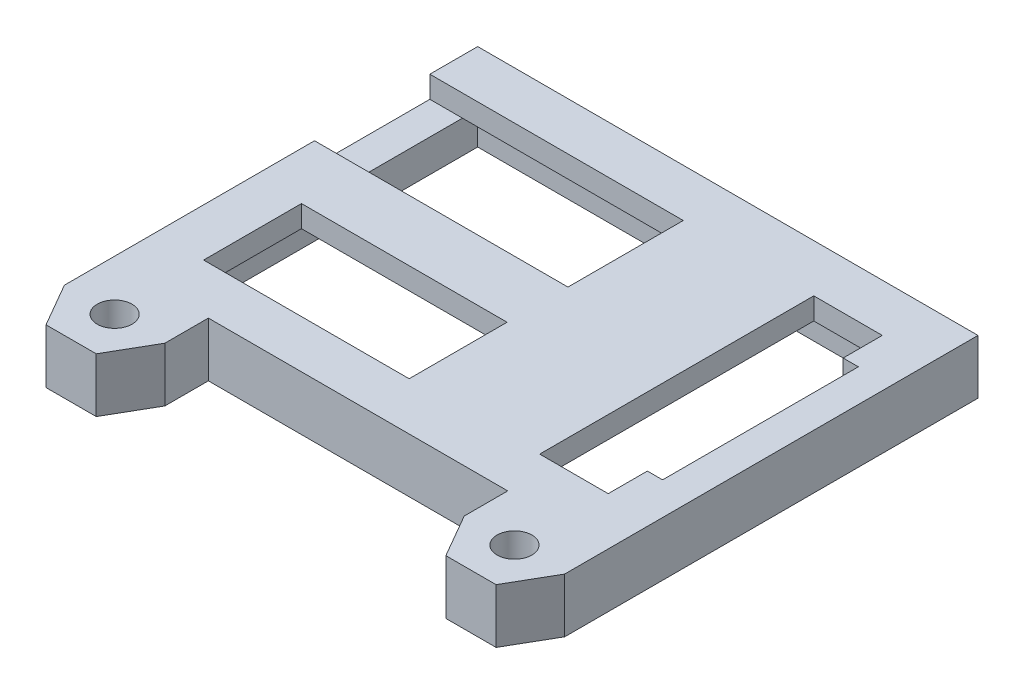
ISO-10303-21;
HEADER;
FILE_DESCRIPTION(('STEP AP214'),'2;1');
FILE_NAME('part.step','',(''),(''),'','','');
FILE_SCHEMA(('AUTOMOTIVE_DESIGN { 1 0 10303 214 1 1 1 1 }'));
ENDSEC;
DATA;
#1=APPLICATION_CONTEXT('core data for automotive mechanical design processes');
#2=APPLICATION_PROTOCOL_DEFINITION('international standard','automotive_design',2000,#1);
#3=PRODUCT_CONTEXT('',#1,'mechanical');
#4=PRODUCT('Part','Part','',(#3));
#5=PRODUCT_RELATED_PRODUCT_CATEGORY('part','',(#4));
#6=PRODUCT_DEFINITION_FORMATION('','',#4);
#7=PRODUCT_DEFINITION_CONTEXT('part definition',#1,'design');
#8=PRODUCT_DEFINITION('design','',#6,#7);
#9=PRODUCT_DEFINITION_SHAPE('','',#8);
#10=(LENGTH_UNIT() NAMED_UNIT(*) SI_UNIT(.MILLI.,.METRE.));
#11=(NAMED_UNIT(*) PLANE_ANGLE_UNIT() SI_UNIT($,.RADIAN.));
#12=(NAMED_UNIT(*) SI_UNIT($,.STERADIAN.) SOLID_ANGLE_UNIT());
#13=UNCERTAINTY_MEASURE_WITH_UNIT(LENGTH_MEASURE(1.E-05),#10,'distance_accuracy_value','');
#14=(GEOMETRIC_REPRESENTATION_CONTEXT(3) GLOBAL_UNCERTAINTY_ASSIGNED_CONTEXT((#13)) GLOBAL_UNIT_ASSIGNED_CONTEXT((#10,
#11,#12)) REPRESENTATION_CONTEXT('',''));
#15=CARTESIAN_POINT('',(0.,0.,0.));
#16=DIRECTION('',(0.,0.,1.));
#17=DIRECTION('',(1.,0.,0.));
#18=AXIS2_PLACEMENT_3D('',#15,#16,#17);
#19=CARTESIAN_POINT('',(0.,-2.,17.));
#20=DIRECTION('',(0.,0.,1.));
#21=DIRECTION('',(1.,0.,0.));
#22=AXIS2_PLACEMENT_3D('',#19,#20,#21);
#23=PLANE('',#22);
#24=DIRECTION('',(-1.,0.,0.));
#25=VECTOR('',#24,1.);
#26=CARTESIAN_POINT('',(-23.,-5.,17.));
#27=LINE('',#26,#25);
#28=CARTESIAN_POINT('',(13.762395692966,-5.,17.));
#29=VERTEX_POINT('',#28);
#30=CARTESIAN_POINT('',(-13.762395692966,-5.,17.));
#31=VERTEX_POINT('',#30);
#32=EDGE_CURVE('E64',#29,#31,#27,.T.);
#33=ORIENTED_EDGE('',*,*,#32,.F.);
#34=DIRECTION('',(0.,1.,0.));
#35=VECTOR('',#34,1.);
#36=CARTESIAN_POINT('',(13.762395692966,-5.,17.));
#37=LINE('',#36,#35);
#38=CARTESIAN_POINT('',(13.762395692966,0.,17.));
#39=VERTEX_POINT('',#38);
#40=EDGE_CURVE('E57',#29,#39,#37,.T.);
#41=ORIENTED_EDGE('',*,*,#40,.T.);
#42=DIRECTION('',(1.,0.,0.));
#43=VECTOR('',#42,1.);
#44=CARTESIAN_POINT('',(0.,0.,17.));
#45=LINE('',#44,#43);
#46=CARTESIAN_POINT('',(-13.762395692966,0.,17.));
#47=VERTEX_POINT('',#46);
#48=EDGE_CURVE('E447',#47,#39,#45,.T.);
#49=ORIENTED_EDGE('',*,*,#48,.F.);
#50=DIRECTION('',(0.,1.,0.));
#51=VECTOR('',#50,1.);
#52=CARTESIAN_POINT('',(-13.762395692966,-5.,17.));
#53=LINE('',#52,#51);
#54=EDGE_CURVE('E347',#31,#47,#53,.T.);
#55=ORIENTED_EDGE('',*,*,#54,.F.);
#56=EDGE_LOOP('',(#33,#41,#49,#55));
#57=FACE_BOUND('',#56,.T.);
#58=ADVANCED_FACE('F39',(#57),#23,.T.);
#59=CARTESIAN_POINT('',(0.,-2.,-12.6));
#60=DIRECTION('',(0.,0.,-1.));
#61=DIRECTION('',(-1.,0.,0.));
#62=AXIS2_PLACEMENT_3D('',#59,#60,#61);
#63=PLANE('',#62);
#64=DIRECTION('',(-1.,0.,0.));
#65=VECTOR('',#64,1.);
#66=CARTESIAN_POINT('',(0.,0.,-12.6));
#67=LINE('',#66,#65);
#68=CARTESIAN_POINT('',(18.6,0.,-12.6));
#69=VERTEX_POINT('',#68);
#70=CARTESIAN_POINT('',(12.3,0.,-12.6));
#71=VERTEX_POINT('',#70);
#72=EDGE_CURVE('E441',#69,#71,#67,.T.);
#73=ORIENTED_EDGE('',*,*,#72,.T.);
#74=DIRECTION('',(0.,1.,0.));
#75=VECTOR('',#74,1.);
#76=CARTESIAN_POINT('',(12.3,-2.,-12.6));
#77=LINE('',#76,#75);
#78=CARTESIAN_POINT('',(12.3,-2.,-12.6));
#79=VERTEX_POINT('',#78);
#80=EDGE_CURVE('E471',#79,#71,#77,.T.);
#81=ORIENTED_EDGE('',*,*,#80,.F.);
#82=DIRECTION('',(-1.,0.,0.));
#83=VECTOR('',#82,1.);
#84=CARTESIAN_POINT('',(0.,-2.,-12.6));
#85=LINE('',#84,#83);
#86=CARTESIAN_POINT('',(18.6,-2.,-12.6));
#87=VERTEX_POINT('',#86);
#88=EDGE_CURVE('E406',#87,#79,#85,.T.);
#89=ORIENTED_EDGE('',*,*,#88,.F.);
#90=DIRECTION('',(0.,1.,0.));
#91=VECTOR('',#90,1.);
#92=CARTESIAN_POINT('',(18.6,-2.,-12.6));
#93=LINE('',#92,#91);
#94=EDGE_CURVE('E486',#87,#69,#93,.T.);
#95=ORIENTED_EDGE('',*,*,#94,.T.);
#96=EDGE_LOOP('',(#73,#81,#89,#95));
#97=FACE_BOUND('',#96,.T.);
#98=ADVANCED_FACE('F596',(#97),#63,.F.);
#99=CARTESIAN_POINT('',(12.3,-2.,0.));
#100=DIRECTION('',(1.,0.,0.));
#101=DIRECTION('',(0.,0.,-1.));
#102=AXIS2_PLACEMENT_3D('',#99,#100,#101);
#103=PLANE('',#102);
#104=DIRECTION('',(0.,0.,-1.));
#105=VECTOR('',#104,1.);
#106=CARTESIAN_POINT('',(12.3,0.,0.));
#107=LINE('',#106,#105);
#108=CARTESIAN_POINT('',(12.3,0.,12.6));
#109=VERTEX_POINT('',#108);
#110=EDGE_CURVE('E393',#109,#71,#107,.T.);
#111=ORIENTED_EDGE('',*,*,#110,.F.);
#112=DIRECTION('',(0.,1.,0.));
#113=VECTOR('',#112,1.);
#114=CARTESIAN_POINT('',(12.3,-2.,12.6));
#115=LINE('',#114,#113);
#116=CARTESIAN_POINT('',(12.3,-2.,12.6));
#117=VERTEX_POINT('',#116);
#118=EDGE_CURVE('E473',#117,#109,#115,.T.);
#119=ORIENTED_EDGE('',*,*,#118,.F.);
#120=DIRECTION('',(0.,0.,-1.));
#121=VECTOR('',#120,1.);
#122=CARTESIAN_POINT('',(12.3,-2.,0.));
#123=LINE('',#122,#121);
#124=EDGE_CURVE('E423',#117,#79,#123,.T.);
#125=ORIENTED_EDGE('',*,*,#124,.T.);
#126=ORIENTED_EDGE('',*,*,#80,.T.);
#127=EDGE_LOOP('',(#111,#119,#125,#126));
#128=FACE_BOUND('',#127,.T.);
#129=ADVANCED_FACE('F599',(#128),#103,.T.);
#130=CARTESIAN_POINT('',(0.,-2.,12.6));
#131=DIRECTION('',(0.,0.,1.));
#132=DIRECTION('',(1.,0.,0.));
#133=AXIS2_PLACEMENT_3D('',#130,#131,#132);
#134=PLANE('',#133);
#135=DIRECTION('',(1.,0.,0.));
#136=VECTOR('',#135,1.);
#137=CARTESIAN_POINT('',(0.,0.,12.6));
#138=LINE('',#137,#136);
#139=CARTESIAN_POINT('',(18.6,0.,12.6));
#140=VERTEX_POINT('',#139);
#141=EDGE_CURVE('E436',#109,#140,#138,.T.);
#142=ORIENTED_EDGE('',*,*,#141,.T.);
#143=DIRECTION('',(0.,1.,0.));
#144=VECTOR('',#143,1.);
#145=CARTESIAN_POINT('',(18.6,-2.,12.6));
#146=LINE('',#145,#144);
#147=CARTESIAN_POINT('',(18.6,-2.,12.6));
#148=VERTEX_POINT('',#147);
#149=EDGE_CURVE('E475',#148,#140,#146,.T.);
#150=ORIENTED_EDGE('',*,*,#149,.F.);
#151=DIRECTION('',(1.,0.,0.));
#152=VECTOR('',#151,1.);
#153=CARTESIAN_POINT('',(0.,-2.,12.6));
#154=LINE('',#153,#152);
#155=EDGE_CURVE('E400',#117,#148,#154,.T.);
#156=ORIENTED_EDGE('',*,*,#155,.F.);
#157=ORIENTED_EDGE('',*,*,#118,.T.);
#158=EDGE_LOOP('',(#142,#150,#156,#157));
#159=FACE_BOUND('',#158,.T.);
#160=ADVANCED_FACE('F605',(#159),#134,.F.);
#161=CARTESIAN_POINT('',(18.5999999999961,-2.,-5.77200324573237E-12));
#162=DIRECTION('',(-1.,0.,3.10322755146967E-13));
#163=DIRECTION('',(3.10322755146967E-13,0.,1.));
#164=AXIS2_PLACEMENT_3D('',#161,#162,#163);
#165=PLANE('',#164);
#166=DIRECTION('',(3.10322755146967E-13,0.,1.));
#167=VECTOR('',#166,1.);
#168=CARTESIAN_POINT('',(18.5999999999961,0.,-5.77200324573237E-12));
#169=LINE('',#168,#167);
#170=CARTESIAN_POINT('',(18.5999999999994,0.,9.00000000000005));
#171=VERTEX_POINT('',#170);
#172=EDGE_CURVE('E466',#171,#140,#169,.T.);
#173=ORIENTED_EDGE('',*,*,#172,.F.);
#174=DIRECTION('',(0.,1.,0.));
#175=VECTOR('',#174,1.);
#176=CARTESIAN_POINT('',(18.5999999999994,-2.,9.00000000000005));
#177=LINE('',#176,#175);
#178=CARTESIAN_POINT('',(18.5999999999994,-2.,9.00000000000005));
#179=VERTEX_POINT('',#178);
#180=EDGE_CURVE('E477',#179,#171,#177,.T.);
#181=ORIENTED_EDGE('',*,*,#180,.F.);
#182=DIRECTION('',(3.10322755146967E-13,0.,1.));
#183=VECTOR('',#182,1.);
#184=CARTESIAN_POINT('',(18.5999999999961,-2.,-5.77200324573237E-12));
#185=LINE('',#184,#183);
#186=EDGE_CURVE('E420',#179,#148,#185,.T.);
#187=ORIENTED_EDGE('',*,*,#186,.T.);
#188=ORIENTED_EDGE('',*,*,#149,.T.);
#189=EDGE_LOOP('',(#173,#181,#187,#188));
#190=FACE_BOUND('',#189,.T.);
#191=ADVANCED_FACE('F607',(#190),#165,.T.);
#192=CARTESIAN_POINT('',(0.,-2.,8.99999999999987));
#193=DIRECTION('',(0.,0.,1.));
#194=DIRECTION('',(1.,0.,0.));
#195=AXIS2_PLACEMENT_3D('',#192,#193,#194);
#196=PLANE('',#195);
#197=DIRECTION('',(1.,0.,0.));
#198=VECTOR('',#197,1.);
#199=CARTESIAN_POINT('',(0.,0.,8.99999999999987));
#200=LINE('',#199,#198);
#201=CARTESIAN_POINT('',(20.,0.,9.00000000000006));
#202=VERTEX_POINT('',#201);
#203=EDGE_CURVE('E464',#171,#202,#200,.T.);
#204=ORIENTED_EDGE('',*,*,#203,.T.);
#205=DIRECTION('',(0.,1.,0.));
#206=VECTOR('',#205,1.);
#207=CARTESIAN_POINT('',(20.,-2.,9.00000000000006));
#208=LINE('',#207,#206);
#209=CARTESIAN_POINT('',(20.,-2.,9.00000000000006));
#210=VERTEX_POINT('',#209);
#211=EDGE_CURVE('E479',#210,#202,#208,.T.);
#212=ORIENTED_EDGE('',*,*,#211,.F.);
#213=DIRECTION('',(1.,0.,0.));
#214=VECTOR('',#213,1.);
#215=CARTESIAN_POINT('',(0.,-2.,8.99999999999987));
#216=LINE('',#215,#214);
#217=EDGE_CURVE('E417',#179,#210,#216,.T.);
#218=ORIENTED_EDGE('',*,*,#217,.F.);
#219=ORIENTED_EDGE('',*,*,#180,.T.);
#220=EDGE_LOOP('',(#204,#212,#218,#219));
#221=FACE_BOUND('',#220,.T.);
#222=ADVANCED_FACE('F536',(#221),#196,.F.);
#223=CARTESIAN_POINT('',(20.,-2.,0.));
#224=DIRECTION('',(1.,0.,0.));
#225=DIRECTION('',(0.,0.,-1.));
#226=AXIS2_PLACEMENT_3D('',#223,#224,#225);
#227=PLANE('',#226);
#228=DIRECTION('',(0.,0.,-1.));
#229=VECTOR('',#228,1.);
#230=CARTESIAN_POINT('',(20.,0.,0.));
#231=LINE('',#230,#229);
#232=CARTESIAN_POINT('',(20.,0.,-8.99999999999994));
#233=VERTEX_POINT('',#232);
#234=EDGE_CURVE('E461',#202,#233,#231,.T.);
#235=ORIENTED_EDGE('',*,*,#234,.T.);
#236=DIRECTION('',(0.,1.,0.));
#237=VECTOR('',#236,1.);
#238=CARTESIAN_POINT('',(20.,-2.,-8.99999999999994));
#239=LINE('',#238,#237);
#240=CARTESIAN_POINT('',(20.,-2.,-8.99999999999994));
#241=VERTEX_POINT('',#240);
#242=EDGE_CURVE('E482',#241,#233,#239,.T.);
#243=ORIENTED_EDGE('',*,*,#242,.F.);
#244=DIRECTION('',(0.,0.,1.));
#245=VECTOR('',#244,1.);
#246=CARTESIAN_POINT('',(20.,-2.,-14.));
#247=LINE('',#246,#245);
#248=CARTESIAN_POINT('',(20.,-2.,-14.));
#249=VERTEX_POINT('',#248);
#250=EDGE_CURVE('E50',#249,#241,#247,.T.);
#251=ORIENTED_EDGE('',*,*,#250,.F.);
#252=DIRECTION('',(0.,1.,0.));
#253=VECTOR('',#252,1.);
#254=CARTESIAN_POINT('',(20.,-5.,-14.));
#255=LINE('',#254,#253);
#256=CARTESIAN_POINT('',(20.,-5.,-14.));
#257=VERTEX_POINT('',#256);
#258=EDGE_CURVE('E373',#257,#249,#255,.T.);
#259=ORIENTED_EDGE('',*,*,#258,.F.);
#260=DIRECTION('',(0.,0.,1.));
#261=VECTOR('',#260,1.);
#262=CARTESIAN_POINT('',(20.,-5.,-14.));
#263=LINE('',#262,#261);
#264=CARTESIAN_POINT('',(20.,-5.,14.));
#265=VERTEX_POINT('',#264);
#266=EDGE_CURVE('E356',#257,#265,#263,.T.);
#267=ORIENTED_EDGE('',*,*,#266,.T.);
#268=DIRECTION('',(0.,1.,0.));
#269=VECTOR('',#268,1.);
#270=CARTESIAN_POINT('',(20.,-5.,14.));
#271=LINE('',#270,#269);
#272=CARTESIAN_POINT('',(20.,-2.,14.));
#273=VERTEX_POINT('',#272);
#274=EDGE_CURVE('E371',#265,#273,#271,.T.);
#275=ORIENTED_EDGE('',*,*,#274,.T.);
#276=EDGE_CURVE('E11',#210,#273,#247,.T.);
#277=ORIENTED_EDGE('',*,*,#276,.F.);
#278=ORIENTED_EDGE('',*,*,#211,.T.);
#279=EDGE_LOOP('',(#235,#243,#251,#259,#267,#275,#277,#278));
#280=FACE_BOUND('',#279,.T.);
#281=ADVANCED_FACE('F540',(#280),#227,.F.);
#282=CARTESIAN_POINT('',(0.,-2.,-9.00000000000013));
#283=DIRECTION('',(0.,0.,1.));
#284=DIRECTION('',(1.,0.,0.));
#285=AXIS2_PLACEMENT_3D('',#282,#283,#284);
#286=PLANE('',#285);
#287=DIRECTION('',(1.,0.,0.));
#288=VECTOR('',#287,1.);
#289=CARTESIAN_POINT('',(0.,0.,-9.00000000000013));
#290=LINE('',#289,#288);
#291=CARTESIAN_POINT('',(18.6,0.,-8.99999999999994));
#292=VERTEX_POINT('',#291);
#293=EDGE_CURVE('E458',#292,#233,#290,.T.);
#294=ORIENTED_EDGE('',*,*,#293,.F.);
#295=DIRECTION('',(0.,1.,0.));
#296=VECTOR('',#295,1.);
#297=CARTESIAN_POINT('',(18.6,-2.,-8.99999999999994));
#298=LINE('',#297,#296);
#299=CARTESIAN_POINT('',(18.6,-2.,-8.99999999999994));
#300=VERTEX_POINT('',#299);
#301=EDGE_CURVE('E484',#300,#292,#298,.T.);
#302=ORIENTED_EDGE('',*,*,#301,.F.);
#303=DIRECTION('',(1.,0.,0.));
#304=VECTOR('',#303,1.);
#305=CARTESIAN_POINT('',(0.,-2.,-9.00000000000013));
#306=LINE('',#305,#304);
#307=EDGE_CURVE('E414',#300,#241,#306,.T.);
#308=ORIENTED_EDGE('',*,*,#307,.T.);
#309=ORIENTED_EDGE('',*,*,#242,.T.);
#310=EDGE_LOOP('',(#294,#302,#308,#309));
#311=FACE_BOUND('',#310,.T.);
#312=ADVANCED_FACE('F549',(#311),#286,.T.);
#313=CARTESIAN_POINT('',(0.3,0.,-12.6));
#314=VERTEX_POINT('',#313);
#315=CARTESIAN_POINT('',(-23.,0.,-12.6));
#316=VERTEX_POINT('',#315);
#317=EDGE_CURVE('E438',#314,#316,#67,.T.);
#318=ORIENTED_EDGE('',*,*,#317,.T.);
#319=DIRECTION('',(0.,1.,0.));
#320=VECTOR('',#319,1.);
#321=CARTESIAN_POINT('',(-23.,-2.,-12.6));
#322=LINE('',#321,#320);
#323=CARTESIAN_POINT('',(-23.,-2.,-12.6));
#324=VERTEX_POINT('',#323);
#325=EDGE_CURVE('E488',#324,#316,#322,.T.);
#326=ORIENTED_EDGE('',*,*,#325,.F.);
#327=CARTESIAN_POINT('',(-20.,-2.,-12.6));
#328=VERTEX_POINT('',#327);
#329=EDGE_CURVE('E402',#328,#324,#85,.T.);
#330=ORIENTED_EDGE('',*,*,#329,.F.);
#331=CARTESIAN_POINT('',(0.3,-2.,-12.6));
#332=VERTEX_POINT('',#331);
#333=EDGE_CURVE('E403',#332,#328,#85,.T.);
#334=ORIENTED_EDGE('',*,*,#333,.F.);
#335=DIRECTION('',(0.,1.,0.));
#336=VECTOR('',#335,1.);
#337=CARTESIAN_POINT('',(0.3,-2.,-12.6));
#338=LINE('',#337,#336);
#339=EDGE_CURVE('E499',#332,#314,#338,.T.);
#340=ORIENTED_EDGE('',*,*,#339,.T.);
#341=EDGE_LOOP('',(#318,#326,#330,#334,#340));
#342=FACE_BOUND('',#341,.T.);
#343=ADVANCED_FACE('F585',(#342),#63,.F.);
#344=CARTESIAN_POINT('',(-23.,-2.,0.));
#345=DIRECTION('',(-1.,0.,0.));
#346=DIRECTION('',(0.,0.,1.));
#347=AXIS2_PLACEMENT_3D('',#344,#345,#346);
#348=PLANE('',#347);
#349=DIRECTION('',(0.,0.,1.));
#350=VECTOR('',#349,1.);
#351=CARTESIAN_POINT('',(-23.,0.,0.));
#352=LINE('',#351,#350);
#353=CARTESIAN_POINT('',(-23.,0.,-17.));
#354=VERTEX_POINT('',#353);
#355=EDGE_CURVE('E448',#354,#316,#352,.T.);
#356=ORIENTED_EDGE('',*,*,#355,.F.);
#357=DIRECTION('',(0.,1.,0.));
#358=VECTOR('',#357,1.);
#359=CARTESIAN_POINT('',(-23.,-2.,-17.));
#360=LINE('',#359,#358);
#361=CARTESIAN_POINT('',(-23.,-5.,-17.));
#362=VERTEX_POINT('',#361);
#363=EDGE_CURVE('E490',#362,#354,#360,.T.);
#364=ORIENTED_EDGE('',*,*,#363,.F.);
#365=DIRECTION('',(0.,0.,-1.));
#366=VECTOR('',#365,1.);
#367=CARTESIAN_POINT('',(-23.,-5.,-2.));
#368=LINE('',#367,#366);
#369=CARTESIAN_POINT('',(-23.,-5.,21.));
#370=VERTEX_POINT('',#369);
#371=EDGE_CURVE('E383',#370,#362,#368,.T.);
#372=ORIENTED_EDGE('',*,*,#371,.F.);
#373=DIRECTION('',(0.,1.,0.));
#374=VECTOR('',#373,1.);
#375=CARTESIAN_POINT('',(-23.,-5.,21.));
#376=LINE('',#375,#374);
#377=CARTESIAN_POINT('',(-23.,0.,21.));
#378=VERTEX_POINT('',#377);
#379=EDGE_CURVE('E344',#370,#378,#376,.T.);
#380=ORIENTED_EDGE('',*,*,#379,.T.);
#381=CARTESIAN_POINT('',(-23.,0.,-2.));
#382=VERTEX_POINT('',#381);
#383=EDGE_CURVE('E445',#382,#378,#352,.T.);
#384=ORIENTED_EDGE('',*,*,#383,.F.);
#385=DIRECTION('',(0.,1.,0.));
#386=VECTOR('',#385,1.);
#387=CARTESIAN_POINT('',(-23.,-2.,-2.));
#388=LINE('',#387,#386);
#389=CARTESIAN_POINT('',(-23.,-2.,-2.));
#390=VERTEX_POINT('',#389);
#391=EDGE_CURVE('E495',#390,#382,#388,.T.);
#392=ORIENTED_EDGE('',*,*,#391,.F.);
#393=DIRECTION('',(0.,0.,-1.));
#394=VECTOR('',#393,1.);
#395=CARTESIAN_POINT('',(-23.,-2.,-17.));
#396=LINE('',#395,#394);
#397=EDGE_CURVE('E377',#390,#324,#396,.T.);
#398=ORIENTED_EDGE('',*,*,#397,.T.);
#399=ORIENTED_EDGE('',*,*,#325,.T.);
#400=EDGE_LOOP('',(#356,#364,#372,#380,#384,#392,#398,#399));
#401=FACE_BOUND('',#400,.T.);
#402=ADVANCED_FACE('F658',(#401),#348,.T.);
#403=CARTESIAN_POINT('',(0.,-2.,-17.));
#404=DIRECTION('',(0.,0.,1.));
#405=DIRECTION('',(1.,0.,0.));
#406=AXIS2_PLACEMENT_3D('',#403,#404,#405);
#407=PLANE('',#406);
#408=DIRECTION('',(1.,0.,0.));
#409=VECTOR('',#408,1.);
#410=CARTESIAN_POINT('',(0.,0.,-17.));
#411=LINE('',#410,#409);
#412=CARTESIAN_POINT('',(23.,0.,-17.));
#413=VERTEX_POINT('',#412);
#414=EDGE_CURVE('E453',#354,#413,#411,.T.);
#415=ORIENTED_EDGE('',*,*,#414,.T.);
#416=DIRECTION('',(0.,1.,0.));
#417=VECTOR('',#416,1.);
#418=CARTESIAN_POINT('',(23.,-2.,-17.));
#419=LINE('',#418,#417);
#420=CARTESIAN_POINT('',(23.,-5.,-17.));
#421=VERTEX_POINT('',#420);
#422=EDGE_CURVE('E492',#421,#413,#419,.T.);
#423=ORIENTED_EDGE('',*,*,#422,.F.);
#424=DIRECTION('',(1.,0.,0.));
#425=VECTOR('',#424,1.);
#426=CARTESIAN_POINT('',(-23.,-5.,-17.));
#427=LINE('',#426,#425);
#428=EDGE_CURVE('E378',#362,#421,#427,.T.);
#429=ORIENTED_EDGE('',*,*,#428,.F.);
#430=ORIENTED_EDGE('',*,*,#363,.T.);
#431=EDGE_LOOP('',(#415,#423,#429,#430));
#432=FACE_BOUND('',#431,.T.);
#433=ADVANCED_FACE('F650',(#432),#407,.F.);
#434=CARTESIAN_POINT('',(23.,-2.,0.));
#435=DIRECTION('',(-1.,0.,0.));
#436=DIRECTION('',(0.,0.,1.));
#437=AXIS2_PLACEMENT_3D('',#434,#435,#436);
#438=PLANE('',#437);
#439=DIRECTION('',(0.,0.,1.));
#440=VECTOR('',#439,1.);
#441=CARTESIAN_POINT('',(23.,0.,0.));
#442=LINE('',#441,#440);
#443=CARTESIAN_POINT('',(23.,0.,21.));
#444=VERTEX_POINT('',#443);
#445=EDGE_CURVE('E451',#413,#444,#442,.T.);
#446=ORIENTED_EDGE('',*,*,#445,.T.);
#447=DIRECTION('',(0.,1.,0.));
#448=VECTOR('',#447,1.);
#449=CARTESIAN_POINT('',(23.,-5.,21.));
#450=LINE('',#449,#448);
#451=CARTESIAN_POINT('',(23.,-5.,21.));
#452=VERTEX_POINT('',#451);
#453=EDGE_CURVE('E305',#452,#444,#450,.T.);
#454=ORIENTED_EDGE('',*,*,#453,.F.);
#455=DIRECTION('',(0.,0.,1.));
#456=VECTOR('',#455,1.);
#457=CARTESIAN_POINT('',(23.,-5.,-17.));
#458=LINE('',#457,#456);
#459=EDGE_CURVE('E380',#421,#452,#458,.T.);
#460=ORIENTED_EDGE('',*,*,#459,.F.);
#461=ORIENTED_EDGE('',*,*,#422,.T.);
#462=EDGE_LOOP('',(#446,#454,#460,#461));
#463=FACE_BOUND('',#462,.T.);
#464=ADVANCED_FACE('F625',(#463),#438,.F.);
#465=CARTESIAN_POINT('',(0.,-2.,-2.));
#466=DIRECTION('',(0.,0.,-1.));
#467=DIRECTION('',(-1.,0.,0.));
#468=AXIS2_PLACEMENT_3D('',#465,#466,#467);
#469=PLANE('',#468);
#470=DIRECTION('',(-1.,0.,0.));
#471=VECTOR('',#470,1.);
#472=CARTESIAN_POINT('',(0.,0.,-2.));
#473=LINE('',#472,#471);
#474=CARTESIAN_POINT('',(0.299999999999999,0.,-2.));
#475=VERTEX_POINT('',#474);
#476=EDGE_CURVE('E442',#475,#382,#473,.T.);
#477=ORIENTED_EDGE('',*,*,#476,.F.);
#478=DIRECTION('',(0.,1.,0.));
#479=VECTOR('',#478,1.);
#480=CARTESIAN_POINT('',(0.299999999999999,-2.,-2.));
#481=LINE('',#480,#479);
#482=CARTESIAN_POINT('',(0.299999999999999,-2.,-2.));
#483=VERTEX_POINT('',#482);
#484=EDGE_CURVE('E497',#483,#475,#481,.T.);
#485=ORIENTED_EDGE('',*,*,#484,.F.);
#486=DIRECTION('',(-1.,0.,0.));
#487=VECTOR('',#486,1.);
#488=CARTESIAN_POINT('',(0.,-2.,-2.));
#489=LINE('',#488,#487);
#490=CARTESIAN_POINT('',(-20.,-2.,-2.));
#491=VERTEX_POINT('',#490);
#492=EDGE_CURVE('E407',#483,#491,#489,.T.);
#493=ORIENTED_EDGE('',*,*,#492,.T.);
#494=EDGE_CURVE('E410',#491,#390,#489,.T.);
#495=ORIENTED_EDGE('',*,*,#494,.T.);
#496=ORIENTED_EDGE('',*,*,#391,.T.);
#497=EDGE_LOOP('',(#477,#485,#493,#495,#496));
#498=FACE_BOUND('',#497,.T.);
#499=ADVANCED_FACE('F576',(#498),#469,.T.);
#500=CARTESIAN_POINT('',(0.,-2.,3.6));
#501=DIRECTION('',(0.,0.,1.));
#502=DIRECTION('',(1.,0.,0.));
#503=AXIS2_PLACEMENT_3D('',#500,#501,#502);
#504=PLANE('',#503);
#505=DIRECTION('',(1.,0.,0.));
#506=VECTOR('',#505,1.);
#507=CARTESIAN_POINT('',(0.,0.,3.6));
#508=LINE('',#507,#506);
#509=CARTESIAN_POINT('',(-18.6,0.,3.6));
#510=VERTEX_POINT('',#509);
#511=CARTESIAN_POINT('',(0.3,0.,3.6));
#512=VERTEX_POINT('',#511);
#513=EDGE_CURVE('E386',#510,#512,#508,.T.);
#514=ORIENTED_EDGE('',*,*,#513,.F.);
#515=DIRECTION('',(0.,1.,0.));
#516=VECTOR('',#515,1.);
#517=CARTESIAN_POINT('',(-18.6,-2.,3.6));
#518=LINE('',#517,#516);
#519=CARTESIAN_POINT('',(-18.6,-2.,3.6));
#520=VERTEX_POINT('',#519);
#521=EDGE_CURVE('E501',#520,#510,#518,.T.);
#522=ORIENTED_EDGE('',*,*,#521,.F.);
#523=DIRECTION('',(1.,0.,0.));
#524=VECTOR('',#523,1.);
#525=CARTESIAN_POINT('',(0.,-2.,3.6));
#526=LINE('',#525,#524);
#527=CARTESIAN_POINT('',(0.3,-2.,3.6));
#528=VERTEX_POINT('',#527);
#529=EDGE_CURVE('E389',#520,#528,#526,.T.);
#530=ORIENTED_EDGE('',*,*,#529,.T.);
#531=DIRECTION('',(0.,1.,0.));
#532=VECTOR('',#531,1.);
#533=CARTESIAN_POINT('',(0.3,-2.,3.6));
#534=LINE('',#533,#532);
#535=EDGE_CURVE('E43',#528,#512,#534,.T.);
#536=ORIENTED_EDGE('',*,*,#535,.T.);
#537=EDGE_LOOP('',(#514,#522,#530,#536));
#538=FACE_BOUND('',#537,.T.);
#539=ADVANCED_FACE('F41',(#538),#504,.T.);
#540=CARTESIAN_POINT('',(-18.6,-2.,0.));
#541=DIRECTION('',(-1.,0.,0.));
#542=DIRECTION('',(0.,0.,1.));
#543=AXIS2_PLACEMENT_3D('',#540,#541,#542);
#544=PLANE('',#543);
#545=DIRECTION('',(0.,0.,1.));
#546=VECTOR('',#545,1.);
#547=CARTESIAN_POINT('',(-18.6,0.,0.));
#548=LINE('',#547,#546);
#549=CARTESIAN_POINT('',(-18.6,0.,12.6));
#550=VERTEX_POINT('',#549);
#551=EDGE_CURVE('E435',#510,#550,#548,.T.);
#552=ORIENTED_EDGE('',*,*,#551,.T.);
#553=DIRECTION('',(0.,1.,0.));
#554=VECTOR('',#553,1.);
#555=CARTESIAN_POINT('',(-18.6,-2.,12.6));
#556=LINE('',#555,#554);
#557=CARTESIAN_POINT('',(-18.6,-2.,12.6));
#558=VERTEX_POINT('',#557);
#559=EDGE_CURVE('E503',#558,#550,#556,.T.);
#560=ORIENTED_EDGE('',*,*,#559,.F.);
#561=DIRECTION('',(0.,0.,1.));
#562=VECTOR('',#561,1.);
#563=CARTESIAN_POINT('',(-18.6,-2.,0.));
#564=LINE('',#563,#562);
#565=EDGE_CURVE('E399',#520,#558,#564,.T.);
#566=ORIENTED_EDGE('',*,*,#565,.F.);
#567=ORIENTED_EDGE('',*,*,#521,.T.);
#568=EDGE_LOOP('',(#552,#560,#566,#567));
#569=FACE_BOUND('',#568,.T.);
#570=ADVANCED_FACE('F521',(#569),#544,.F.);
#571=CARTESIAN_POINT('',(0.3,0.,12.6));
#572=VERTEX_POINT('',#571);
#573=EDGE_CURVE('E431',#550,#572,#138,.T.);
#574=ORIENTED_EDGE('',*,*,#573,.T.);
#575=DIRECTION('',(0.,1.,0.));
#576=VECTOR('',#575,1.);
#577=CARTESIAN_POINT('',(0.3,-2.,12.6));
#578=LINE('',#577,#576);
#579=CARTESIAN_POINT('',(0.3,-2.,12.6));
#580=VERTEX_POINT('',#579);
#581=EDGE_CURVE('E505',#580,#572,#578,.T.);
#582=ORIENTED_EDGE('',*,*,#581,.F.);
#583=EDGE_CURVE('E396',#558,#580,#154,.T.);
#584=ORIENTED_EDGE('',*,*,#583,.F.);
#585=ORIENTED_EDGE('',*,*,#559,.T.);
#586=EDGE_LOOP('',(#574,#582,#584,#585));
#587=FACE_BOUND('',#586,.T.);
#588=ADVANCED_FACE('F525',(#587),#134,.F.);
#589=CARTESIAN_POINT('',(0.3,-2.,0.));
#590=DIRECTION('',(-1.,0.,0.));
#591=DIRECTION('',(0.,0.,1.));
#592=AXIS2_PLACEMENT_3D('',#589,#590,#591);
#593=PLANE('',#592);
#594=DIRECTION('',(0.,0.,1.));
#595=VECTOR('',#594,1.);
#596=CARTESIAN_POINT('',(0.3,0.,0.));
#597=LINE('',#596,#595);
#598=EDGE_CURVE('E432',#314,#475,#597,.T.);
#599=ORIENTED_EDGE('',*,*,#598,.F.);
#600=ORIENTED_EDGE('',*,*,#339,.F.);
#601=DIRECTION('',(0.,0.,1.));
#602=VECTOR('',#601,1.);
#603=CARTESIAN_POINT('',(0.3,-2.,0.));
#604=LINE('',#603,#602);
#605=EDGE_CURVE('E397',#332,#483,#604,.T.);
#606=ORIENTED_EDGE('',*,*,#605,.T.);
#607=ORIENTED_EDGE('',*,*,#484,.T.);
#608=EDGE_LOOP('',(#599,#600,#606,#607));
#609=FACE_BOUND('',#608,.T.);
#610=ADVANCED_FACE('F581',(#609),#593,.T.);
#611=EDGE_CURVE('E428',#512,#572,#597,.T.);
#612=ORIENTED_EDGE('',*,*,#611,.F.);
#613=ORIENTED_EDGE('',*,*,#535,.F.);
#614=EDGE_CURVE('E392',#528,#580,#604,.T.);
#615=ORIENTED_EDGE('',*,*,#614,.T.);
#616=ORIENTED_EDGE('',*,*,#581,.T.);
#617=EDGE_LOOP('',(#612,#613,#615,#616));
#618=FACE_BOUND('',#617,.T.);
#619=ADVANCED_FACE('F513',(#618),#593,.T.);
#620=CARTESIAN_POINT('',(18.6,-2.,0.));
#621=DIRECTION('',(-1.,0.,0.));
#622=DIRECTION('',(0.,0.,1.));
#623=AXIS2_PLACEMENT_3D('',#620,#621,#622);
#624=PLANE('',#623);
#625=DIRECTION('',(0.,0.,1.));
#626=VECTOR('',#625,1.);
#627=CARTESIAN_POINT('',(18.6,0.,0.));
#628=LINE('',#627,#626);
#629=EDGE_CURVE('E455',#69,#292,#628,.T.);
#630=ORIENTED_EDGE('',*,*,#629,.F.);
#631=ORIENTED_EDGE('',*,*,#94,.F.);
#632=DIRECTION('',(0.,0.,1.));
#633=VECTOR('',#632,1.);
#634=CARTESIAN_POINT('',(18.6,-2.,0.));
#635=LINE('',#634,#633);
#636=EDGE_CURVE('E411',#87,#300,#635,.T.);
#637=ORIENTED_EDGE('',*,*,#636,.T.);
#638=ORIENTED_EDGE('',*,*,#301,.T.);
#639=EDGE_LOOP('',(#630,#631,#637,#638));
#640=FACE_BOUND('',#639,.T.);
#641=ADVANCED_FACE('F530',(#640),#624,.T.);
#642=CARTESIAN_POINT('',(0.,-2.,0.));
#643=DIRECTION('',(0.,1.,0.));
#644=DIRECTION('',(0.,0.,1.));
#645=AXIS2_PLACEMENT_3D('',#642,#643,#644);
#646=PLANE('',#645);
#647=ORIENTED_EDGE('',*,*,#529,.F.);
#648=ORIENTED_EDGE('',*,*,#565,.T.);
#649=ORIENTED_EDGE('',*,*,#583,.T.);
#650=ORIENTED_EDGE('',*,*,#614,.F.);
#651=EDGE_LOOP('',(#647,#648,#649,#650));
#652=FACE_BOUND('',#651,.T.);
#653=ORIENTED_EDGE('',*,*,#217,.T.);
#654=ORIENTED_EDGE('',*,*,#276,.T.);
#655=DIRECTION('',(-1.,0.,0.));
#656=VECTOR('',#655,1.);
#657=CARTESIAN_POINT('',(-20.,-2.,14.));
#658=LINE('',#657,#656);
#659=CARTESIAN_POINT('',(-20.,-2.,14.));
#660=VERTEX_POINT('',#659);
#661=EDGE_CURVE('E364',#273,#660,#658,.T.);
#662=ORIENTED_EDGE('',*,*,#661,.T.);
#663=DIRECTION('',(0.,0.,-1.));
#664=VECTOR('',#663,1.);
#665=CARTESIAN_POINT('',(-20.,-2.,-2.));
#666=LINE('',#665,#664);
#667=EDGE_CURVE('E354',#660,#491,#666,.T.);
#668=ORIENTED_EDGE('',*,*,#667,.T.);
#669=ORIENTED_EDGE('',*,*,#492,.F.);
#670=ORIENTED_EDGE('',*,*,#605,.F.);
#671=ORIENTED_EDGE('',*,*,#333,.T.);
#672=CARTESIAN_POINT('',(-20.,-2.,-14.));
#673=VERTEX_POINT('',#672);
#674=EDGE_CURVE('E48',#328,#673,#666,.T.);
#675=ORIENTED_EDGE('',*,*,#674,.T.);
#676=DIRECTION('',(1.,0.,0.));
#677=VECTOR('',#676,1.);
#678=CARTESIAN_POINT('',(-20.,-2.,-14.));
#679=LINE('',#678,#677);
#680=EDGE_CURVE('E341',#673,#249,#679,.T.);
#681=ORIENTED_EDGE('',*,*,#680,.T.);
#682=ORIENTED_EDGE('',*,*,#250,.T.);
#683=ORIENTED_EDGE('',*,*,#307,.F.);
#684=ORIENTED_EDGE('',*,*,#636,.F.);
#685=ORIENTED_EDGE('',*,*,#88,.T.);
#686=ORIENTED_EDGE('',*,*,#124,.F.);
#687=ORIENTED_EDGE('',*,*,#155,.T.);
#688=ORIENTED_EDGE('',*,*,#186,.F.);
#689=EDGE_LOOP('',(#653,#654,#662,#668,#669,#670,#671,#675,#681,#682,#683,#684,#685,#686,#687,#688));
#690=FACE_BOUND('',#689,.T.);
#691=ADVANCED_FACE('F527',(#652,#690),#646,.F.);
#692=CARTESIAN_POINT('',(0.,0.,0.));
#693=DIRECTION('',(0.,1.,0.));
#694=DIRECTION('',(0.,0.,1.));
#695=AXIS2_PLACEMENT_3D('',#692,#693,#694);
#696=PLANE('',#695);
#697=ORIENTED_EDGE('',*,*,#513,.T.);
#698=ORIENTED_EDGE('',*,*,#611,.T.);
#699=ORIENTED_EDGE('',*,*,#573,.F.);
#700=ORIENTED_EDGE('',*,*,#551,.F.);
#701=EDGE_LOOP('',(#697,#698,#699,#700));
#702=FACE_BOUND('',#701,.T.);
#703=ORIENTED_EDGE('',*,*,#317,.F.);
#704=ORIENTED_EDGE('',*,*,#598,.T.);
#705=ORIENTED_EDGE('',*,*,#476,.T.);
#706=ORIENTED_EDGE('',*,*,#383,.T.);
#707=DIRECTION('',(0.500000000000001,0.,0.866025403784438));
#708=VECTOR('',#707,1.);
#709=CARTESIAN_POINT('',(-26.3432667397366,0.,15.2092921435211));
#710=LINE('',#709,#708);
#711=CARTESIAN_POINT('',(-20.6905989232415,0.,25.));
#712=VERTEX_POINT('',#711);
#713=EDGE_CURVE('E334',#378,#712,#710,.T.);
#714=ORIENTED_EDGE('',*,*,#713,.T.);
#715=DIRECTION('',(1.,0.,0.));
#716=VECTOR('',#715,1.);
#717=CARTESIAN_POINT('',(0.,0.,25.));
#718=LINE('',#717,#716);
#719=CARTESIAN_POINT('',(-16.0717967697245,0.,25.));
#720=VERTEX_POINT('',#719);
#721=EDGE_CURVE('E313',#712,#720,#718,.T.);
#722=ORIENTED_EDGE('',*,*,#721,.T.);
#723=DIRECTION('',(0.499999999999999,0.,-0.866025403784439));
#724=VECTOR('',#723,1.);
#725=CARTESIAN_POINT('',(-1.2285300299879,0.,-0.709292143521053));
#726=LINE('',#725,#724);
#727=CARTESIAN_POINT('',(-13.762395692966,0.,21.));
#728=VERTEX_POINT('',#727);
#729=EDGE_CURVE('E328',#720,#728,#726,.T.);
#730=ORIENTED_EDGE('',*,*,#729,.T.);
#731=DIRECTION('',(0.,0.,-1.));
#732=VECTOR('',#731,1.);
#733=CARTESIAN_POINT('',(-13.762395692966,0.,0.));
#734=LINE('',#733,#732);
#735=EDGE_CURVE('E331',#728,#47,#734,.T.);
#736=ORIENTED_EDGE('',*,*,#735,.T.);
#737=ORIENTED_EDGE('',*,*,#48,.T.);
#738=DIRECTION('',(0.,0.,-1.));
#739=VECTOR('',#738,1.);
#740=CARTESIAN_POINT('',(13.762395692966,0.,0.));
#741=LINE('',#740,#739);
#742=CARTESIAN_POINT('',(13.762395692966,0.,21.));
#743=VERTEX_POINT('',#742);
#744=EDGE_CURVE('E288',#743,#39,#741,.T.);
#745=ORIENTED_EDGE('',*,*,#744,.F.);
#746=DIRECTION('',(-0.499999999999999,0.,-0.866025403784439));
#747=VECTOR('',#746,1.);
#748=CARTESIAN_POINT('',(1.2285300299879,0.,-0.709292143521053));
#749=LINE('',#748,#747);
#750=CARTESIAN_POINT('',(16.0717967697245,0.,25.));
#751=VERTEX_POINT('',#750);
#752=EDGE_CURVE('E296',#751,#743,#749,.T.);
#753=ORIENTED_EDGE('',*,*,#752,.F.);
#754=DIRECTION('',(-1.,0.,0.));
#755=VECTOR('',#754,1.);
#756=CARTESIAN_POINT('',(0.,0.,25.));
#757=LINE('',#756,#755);
#758=CARTESIAN_POINT('',(20.6905989232415,0.,25.));
#759=VERTEX_POINT('',#758);
#760=EDGE_CURVE('E275',#759,#751,#757,.T.);
#761=ORIENTED_EDGE('',*,*,#760,.F.);
#762=DIRECTION('',(-0.500000000000001,0.,0.866025403784438));
#763=VECTOR('',#762,1.);
#764=CARTESIAN_POINT('',(26.3432667397366,0.,15.2092921435211));
#765=LINE('',#764,#763);
#766=EDGE_CURVE('E299',#444,#759,#765,.T.);
#767=ORIENTED_EDGE('',*,*,#766,.F.);
#768=ORIENTED_EDGE('',*,*,#445,.F.);
#769=ORIENTED_EDGE('',*,*,#414,.F.);
#770=ORIENTED_EDGE('',*,*,#355,.T.);
#771=EDGE_LOOP('',(#703,#704,#705,#706,#714,#722,#730,#736,#737,#745,#753,#761,#767,#768,#769,#770));
#772=FACE_BOUND('',#771,.T.);
#773=ORIENTED_EDGE('',*,*,#72,.F.);
#774=ORIENTED_EDGE('',*,*,#629,.T.);
#775=ORIENTED_EDGE('',*,*,#293,.T.);
#776=ORIENTED_EDGE('',*,*,#234,.F.);
#777=ORIENTED_EDGE('',*,*,#203,.F.);
#778=ORIENTED_EDGE('',*,*,#172,.T.);
#779=ORIENTED_EDGE('',*,*,#141,.F.);
#780=ORIENTED_EDGE('',*,*,#110,.T.);
#781=EDGE_LOOP('',(#773,#774,#775,#776,#777,#778,#779,#780));
#782=FACE_BOUND('',#781,.T.);
#783=CARTESIAN_POINT('',(-18.381197846483,0.,21.));
#784=DIRECTION('',(0.,1.,0.));
#785=DIRECTION('',(0.,0.,1.));
#786=AXIS2_PLACEMENT_3D('',#783,#784,#785);
#787=CIRCLE('',#786,1.6);
#788=CARTESIAN_POINT('',(-18.381197846483,0.,22.6));
#789=VERTEX_POINT('',#788);
#790=EDGE_CURVE('E303',#789,#789,#787,.T.);
#791=ORIENTED_EDGE('',*,*,#790,.F.);
#792=EDGE_LOOP('',(#791));
#793=FACE_BOUND('',#792,.T.);
#794=CARTESIAN_POINT('',(18.381197846483,0.,21.));
#795=DIRECTION('',(0.,1.,0.));
#796=DIRECTION('',(0.,0.,1.));
#797=AXIS2_PLACEMENT_3D('',#794,#795,#796);
#798=CIRCLE('',#797,1.6);
#799=CARTESIAN_POINT('',(18.381197846483,0.,22.6));
#800=VERTEX_POINT('',#799);
#801=EDGE_CURVE('E285',#800,#800,#798,.F.);
#802=ORIENTED_EDGE('',*,*,#801,.T.);
#803=EDGE_LOOP('',(#802));
#804=FACE_BOUND('',#803,.T.);
#805=ADVANCED_FACE('F517',(#702,#772,#782,#793,#804),#696,.T.);
#806=CARTESIAN_POINT('',(0.,-2.,0.));
#807=DIRECTION('',(0.,-1.,0.));
#808=DIRECTION('',(0.,0.,-1.));
#809=AXIS2_PLACEMENT_3D('',#806,#807,#808);
#810=PLANE('',#809);
#811=EDGE_CURVE('E367',#491,#328,#666,.T.);
#812=ORIENTED_EDGE('',*,*,#811,.T.);
#813=ORIENTED_EDGE('',*,*,#329,.T.);
#814=ORIENTED_EDGE('',*,*,#397,.F.);
#815=ORIENTED_EDGE('',*,*,#494,.F.);
#816=EDGE_LOOP('',(#812,#813,#814,#815));
#817=FACE_BOUND('',#816,.T.);
#818=ADVANCED_FACE('F801',(#817),#810,.F.);
#819=CARTESIAN_POINT('',(0.,-5.,0.));
#820=DIRECTION('',(0.,-1.,0.));
#821=DIRECTION('',(0.,0.,-1.));
#822=AXIS2_PLACEMENT_3D('',#819,#820,#821);
#823=PLANE('',#822);
#824=ORIENTED_EDGE('',*,*,#428,.T.);
#825=ORIENTED_EDGE('',*,*,#459,.T.);
#826=DIRECTION('',(-0.500000000000001,0.,0.866025403784438));
#827=VECTOR('',#826,1.);
#828=CARTESIAN_POINT('',(26.3432667397366,-5.,15.2092921435211));
#829=LINE('',#828,#827);
#830=CARTESIAN_POINT('',(20.6905989232415,-5.,25.));
#831=VERTEX_POINT('',#830);
#832=EDGE_CURVE('E266',#452,#831,#829,.T.);
#833=ORIENTED_EDGE('',*,*,#832,.T.);
#834=DIRECTION('',(-1.,0.,0.));
#835=VECTOR('',#834,1.);
#836=CARTESIAN_POINT('',(0.,-5.,25.));
#837=LINE('',#836,#835);
#838=CARTESIAN_POINT('',(16.0717967697245,-5.,25.));
#839=VERTEX_POINT('',#838);
#840=EDGE_CURVE('E257',#831,#839,#837,.T.);
#841=ORIENTED_EDGE('',*,*,#840,.T.);
#842=DIRECTION('',(-0.499999999999999,0.,-0.866025403784439));
#843=VECTOR('',#842,1.);
#844=CARTESIAN_POINT('',(1.2285300299879,-5.,-0.709292143521053));
#845=LINE('',#844,#843);
#846=CARTESIAN_POINT('',(13.762395692966,-5.,21.));
#847=VERTEX_POINT('',#846);
#848=EDGE_CURVE('E263',#839,#847,#845,.T.);
#849=ORIENTED_EDGE('',*,*,#848,.T.);
#850=DIRECTION('',(0.,0.,-1.));
#851=VECTOR('',#850,1.);
#852=CARTESIAN_POINT('',(13.762395692966,-5.,0.));
#853=LINE('',#852,#851);
#854=EDGE_CURVE('E292',#847,#29,#853,.T.);
#855=ORIENTED_EDGE('',*,*,#854,.T.);
#856=ORIENTED_EDGE('',*,*,#32,.T.);
#857=DIRECTION('',(0.,0.,-1.));
#858=VECTOR('',#857,1.);
#859=CARTESIAN_POINT('',(-13.762395692966,-5.,0.));
#860=LINE('',#859,#858);
#861=CARTESIAN_POINT('',(-13.762395692966,-5.,21.));
#862=VERTEX_POINT('',#861);
#863=EDGE_CURVE('E316',#862,#31,#860,.T.);
#864=ORIENTED_EDGE('',*,*,#863,.F.);
#865=DIRECTION('',(0.499999999999999,0.,-0.866025403784439));
#866=VECTOR('',#865,1.);
#867=CARTESIAN_POINT('',(-1.2285300299879,-5.,-0.709292143521053));
#868=LINE('',#867,#866);
#869=CARTESIAN_POINT('',(-16.0717967697245,-5.,25.));
#870=VERTEX_POINT('',#869);
#871=EDGE_CURVE('E312',#870,#862,#868,.T.);
#872=ORIENTED_EDGE('',*,*,#871,.F.);
#873=DIRECTION('',(1.,0.,0.));
#874=VECTOR('',#873,1.);
#875=CARTESIAN_POINT('',(0.,-5.,25.));
#876=LINE('',#875,#874);
#877=CARTESIAN_POINT('',(-20.6905989232415,-5.,25.));
#878=VERTEX_POINT('',#877);
#879=EDGE_CURVE('E322',#878,#870,#876,.T.);
#880=ORIENTED_EDGE('',*,*,#879,.F.);
#881=DIRECTION('',(0.500000000000001,0.,0.866025403784438));
#882=VECTOR('',#881,1.);
#883=CARTESIAN_POINT('',(-26.3432667397366,-5.,15.2092921435211));
#884=LINE('',#883,#882);
#885=EDGE_CURVE('E319',#370,#878,#884,.T.);
#886=ORIENTED_EDGE('',*,*,#885,.F.);
#887=ORIENTED_EDGE('',*,*,#371,.T.);
#888=EDGE_LOOP('',(#824,#825,#833,#841,#849,#855,#856,#864,#872,#880,#886,#887));
#889=FACE_BOUND('',#888,.T.);
#890=ORIENTED_EDGE('',*,*,#266,.F.);
#891=DIRECTION('',(1.,0.,0.));
#892=VECTOR('',#891,1.);
#893=CARTESIAN_POINT('',(-20.,-5.,-14.));
#894=LINE('',#893,#892);
#895=CARTESIAN_POINT('',(-20.,-5.,-14.));
#896=VERTEX_POINT('',#895);
#897=EDGE_CURVE('E353',#896,#257,#894,.T.);
#898=ORIENTED_EDGE('',*,*,#897,.F.);
#899=DIRECTION('',(0.,0.,-1.));
#900=VECTOR('',#899,1.);
#901=CARTESIAN_POINT('',(-20.,-5.,-12.6));
#902=LINE('',#901,#900);
#903=CARTESIAN_POINT('',(-20.,-5.,14.));
#904=VERTEX_POINT('',#903);
#905=EDGE_CURVE('E351',#904,#896,#902,.T.);
#906=ORIENTED_EDGE('',*,*,#905,.F.);
#907=DIRECTION('',(-1.,0.,0.));
#908=VECTOR('',#907,1.);
#909=CARTESIAN_POINT('',(-20.,-5.,14.));
#910=LINE('',#909,#908);
#911=EDGE_CURVE('E358',#265,#904,#910,.T.);
#912=ORIENTED_EDGE('',*,*,#911,.F.);
#913=EDGE_LOOP('',(#890,#898,#906,#912));
#914=FACE_BOUND('',#913,.T.);
#915=CARTESIAN_POINT('',(-18.381197846483,-5.,21.));
#916=DIRECTION('',(0.,1.,0.));
#917=DIRECTION('',(0.,0.,1.));
#918=AXIS2_PLACEMENT_3D('',#915,#916,#917);
#919=CIRCLE('',#918,1.6);
#920=CARTESIAN_POINT('',(-18.381197846483,-5.,22.6));
#921=VERTEX_POINT('',#920);
#922=EDGE_CURVE('E309',#921,#921,#919,.T.);
#923=ORIENTED_EDGE('',*,*,#922,.T.);
#924=EDGE_LOOP('',(#923));
#925=FACE_BOUND('',#924,.T.);
#926=CARTESIAN_POINT('',(18.381197846483,-5.,21.));
#927=DIRECTION('',(0.,1.,0.));
#928=DIRECTION('',(0.,0.,1.));
#929=AXIS2_PLACEMENT_3D('',#926,#927,#928);
#930=CIRCLE('',#929,1.6);
#931=CARTESIAN_POINT('',(18.381197846483,-5.,22.6));
#932=VERTEX_POINT('',#931);
#933=EDGE_CURVE('E280',#932,#932,#930,.F.);
#934=ORIENTED_EDGE('',*,*,#933,.F.);
#935=EDGE_LOOP('',(#934));
#936=FACE_BOUND('',#935,.T.);
#937=ADVANCED_FACE('F260',(#889,#914,#925,#936),#823,.T.);
#938=CARTESIAN_POINT('',(-20.,-5.,-14.));
#939=DIRECTION('',(0.,0.,1.));
#940=DIRECTION('',(1.,0.,0.));
#941=AXIS2_PLACEMENT_3D('',#938,#939,#940);
#942=PLANE('',#941);
#943=ORIENTED_EDGE('',*,*,#680,.F.);
#944=DIRECTION('',(0.,1.,0.));
#945=VECTOR('',#944,1.);
#946=CARTESIAN_POINT('',(-20.,-5.,-14.));
#947=LINE('',#946,#945);
#948=EDGE_CURVE('E375',#896,#673,#947,.T.);
#949=ORIENTED_EDGE('',*,*,#948,.F.);
#950=ORIENTED_EDGE('',*,*,#897,.T.);
#951=ORIENTED_EDGE('',*,*,#258,.T.);
#952=EDGE_LOOP('',(#943,#949,#950,#951));
#953=FACE_BOUND('',#952,.T.);
#954=ADVANCED_FACE('F558',(#953),#942,.T.);
#955=CARTESIAN_POINT('',(-20.,-5.,14.));
#956=DIRECTION('',(0.,0.,-1.));
#957=DIRECTION('',(-1.,0.,0.));
#958=AXIS2_PLACEMENT_3D('',#955,#956,#957);
#959=PLANE('',#958);
#960=ORIENTED_EDGE('',*,*,#661,.F.);
#961=ORIENTED_EDGE('',*,*,#274,.F.);
#962=ORIENTED_EDGE('',*,*,#911,.T.);
#963=DIRECTION('',(0.,1.,0.));
#964=VECTOR('',#963,1.);
#965=CARTESIAN_POINT('',(-20.,-5.,14.));
#966=LINE('',#965,#964);
#967=EDGE_CURVE('E361',#904,#660,#966,.T.);
#968=ORIENTED_EDGE('',*,*,#967,.T.);
#969=EDGE_LOOP('',(#960,#961,#962,#968));
#970=FACE_BOUND('',#969,.T.);
#971=ADVANCED_FACE('F566',(#970),#959,.T.);
#972=CARTESIAN_POINT('',(-20.,-5.,-2.));
#973=DIRECTION('',(1.,0.,0.));
#974=DIRECTION('',(0.,0.,-1.));
#975=AXIS2_PLACEMENT_3D('',#972,#973,#974);
#976=PLANE('',#975);
#977=ORIENTED_EDGE('',*,*,#667,.F.);
#978=ORIENTED_EDGE('',*,*,#967,.F.);
#979=ORIENTED_EDGE('',*,*,#905,.T.);
#980=ORIENTED_EDGE('',*,*,#948,.T.);
#981=ORIENTED_EDGE('',*,*,#674,.F.);
#982=ORIENTED_EDGE('',*,*,#811,.F.);
#983=EDGE_LOOP('',(#977,#978,#979,#980,#981,#982));
#984=FACE_BOUND('',#983,.T.);
#985=ADVANCED_FACE('F830',(#984),#976,.T.);
#986=CARTESIAN_POINT('',(-1.2285300299879,-5.,-0.709292143521053));
#987=DIRECTION('',(0.866025403784439,0.,0.499999999999999));
#988=DIRECTION('',(0.499999999999999,0.,-0.866025403784439));
#989=AXIS2_PLACEMENT_3D('',#986,#987,#988);
#990=PLANE('',#989);
#991=ORIENTED_EDGE('',*,*,#729,.F.);
#992=DIRECTION('',(0.,1.,0.));
#993=VECTOR('',#992,1.);
#994=CARTESIAN_POINT('',(-16.0717967697245,-5.,25.));
#995=LINE('',#994,#993);
#996=EDGE_CURVE('E339',#870,#720,#995,.T.);
#997=ORIENTED_EDGE('',*,*,#996,.F.);
#998=ORIENTED_EDGE('',*,*,#871,.T.);
#999=DIRECTION('',(0.,1.,0.));
#1000=VECTOR('',#999,1.);
#1001=CARTESIAN_POINT('',(-13.762395692966,-5.,21.));
#1002=LINE('',#1001,#1000);
#1003=EDGE_CURVE('E325',#862,#728,#1002,.T.);
#1004=ORIENTED_EDGE('',*,*,#1003,.T.);
#1005=EDGE_LOOP('',(#991,#997,#998,#1004));
#1006=FACE_BOUND('',#1005,.T.);
#1007=ADVANCED_FACE('F834',(#1006),#990,.T.);
#1008=CARTESIAN_POINT('',(0.,-5.,25.));
#1009=DIRECTION('',(0.,0.,1.));
#1010=DIRECTION('',(1.,0.,0.));
#1011=AXIS2_PLACEMENT_3D('',#1008,#1009,#1010);
#1012=PLANE('',#1011);
#1013=ORIENTED_EDGE('',*,*,#721,.F.);
#1014=DIRECTION('',(0.,1.,0.));
#1015=VECTOR('',#1014,1.);
#1016=CARTESIAN_POINT('',(-20.6905989232415,-5.,25.));
#1017=LINE('',#1016,#1015);
#1018=EDGE_CURVE('E342',#878,#712,#1017,.T.);
#1019=ORIENTED_EDGE('',*,*,#1018,.F.);
#1020=ORIENTED_EDGE('',*,*,#879,.T.);
#1021=ORIENTED_EDGE('',*,*,#996,.T.);
#1022=EDGE_LOOP('',(#1013,#1019,#1020,#1021));
#1023=FACE_BOUND('',#1022,.T.);
#1024=ADVANCED_FACE('F882',(#1023),#1012,.T.);
#1025=CARTESIAN_POINT('',(-26.3432667397366,-5.,15.2092921435211));
#1026=DIRECTION('',(-0.866025403784438,0.,0.500000000000001));
#1027=DIRECTION('',(0.500000000000001,0.,0.866025403784438));
#1028=AXIS2_PLACEMENT_3D('',#1025,#1026,#1027);
#1029=PLANE('',#1028);
#1030=ORIENTED_EDGE('',*,*,#713,.F.);
#1031=ORIENTED_EDGE('',*,*,#379,.F.);
#1032=ORIENTED_EDGE('',*,*,#885,.T.);
#1033=ORIENTED_EDGE('',*,*,#1018,.T.);
#1034=EDGE_LOOP('',(#1030,#1031,#1032,#1033));
#1035=FACE_BOUND('',#1034,.T.);
#1036=ADVANCED_FACE('F892',(#1035),#1029,.T.);
#1037=CARTESIAN_POINT('',(-18.381197846483,-5.,21.));
#1038=DIRECTION('',(0.,1.,0.));
#1039=DIRECTION('',(0.,0.,1.));
#1040=AXIS2_PLACEMENT_3D('',#1037,#1038,#1039);
#1041=CYLINDRICAL_SURFACE('',#1040,1.6);
#1042=ORIENTED_EDGE('',*,*,#922,.F.);
#1043=EDGE_LOOP('',(#1042));
#1044=FACE_BOUND('',#1043,.T.);
#1045=ORIENTED_EDGE('',*,*,#790,.T.);
#1046=EDGE_LOOP('',(#1045));
#1047=FACE_BOUND('',#1046,.T.);
#1048=ADVANCED_FACE('F902',(#1044,#1047),#1041,.F.);
#1049=CARTESIAN_POINT('',(-13.762395692966,-5.,0.));
#1050=DIRECTION('',(1.,0.,0.));
#1051=DIRECTION('',(0.,0.,-1.));
#1052=AXIS2_PLACEMENT_3D('',#1049,#1050,#1051);
#1053=PLANE('',#1052);
#1054=ORIENTED_EDGE('',*,*,#735,.F.);
#1055=ORIENTED_EDGE('',*,*,#1003,.F.);
#1056=ORIENTED_EDGE('',*,*,#863,.T.);
#1057=ORIENTED_EDGE('',*,*,#54,.T.);
#1058=EDGE_LOOP('',(#1054,#1055,#1056,#1057));
#1059=FACE_BOUND('',#1058,.T.);
#1060=ADVANCED_FACE('F912',(#1059),#1053,.T.);
#1061=CARTESIAN_POINT('',(1.2285300299879,-5.,-0.709292143521053));
#1062=DIRECTION('',(0.866025403784439,0.,-0.499999999999999));
#1063=DIRECTION('',(-0.499999999999999,0.,-0.866025403784439));
#1064=AXIS2_PLACEMENT_3D('',#1061,#1062,#1063);
#1065=PLANE('',#1064);
#1066=ORIENTED_EDGE('',*,*,#752,.T.);
#1067=DIRECTION('',(0.,1.,0.));
#1068=VECTOR('',#1067,1.);
#1069=CARTESIAN_POINT('',(13.762395692966,-5.,21.));
#1070=LINE('',#1069,#1068);
#1071=EDGE_CURVE('E284',#847,#743,#1070,.T.);
#1072=ORIENTED_EDGE('',*,*,#1071,.F.);
#1073=ORIENTED_EDGE('',*,*,#848,.F.);
#1074=DIRECTION('',(0.,1.,0.));
#1075=VECTOR('',#1074,1.);
#1076=CARTESIAN_POINT('',(16.0717967697245,-5.,25.));
#1077=LINE('',#1076,#1075);
#1078=EDGE_CURVE('E272',#839,#751,#1077,.T.);
#1079=ORIENTED_EDGE('',*,*,#1078,.T.);
#1080=EDGE_LOOP('',(#1066,#1072,#1073,#1079));
#1081=FACE_BOUND('',#1080,.T.);
#1082=ADVANCED_FACE('F282',(#1081),#1065,.F.);
#1083=CARTESIAN_POINT('',(13.762395692966,-5.,0.));
#1084=DIRECTION('',(1.,0.,0.));
#1085=DIRECTION('',(0.,0.,-1.));
#1086=AXIS2_PLACEMENT_3D('',#1083,#1084,#1085);
#1087=PLANE('',#1086);
#1088=ORIENTED_EDGE('',*,*,#744,.T.);
#1089=ORIENTED_EDGE('',*,*,#40,.F.);
#1090=ORIENTED_EDGE('',*,*,#854,.F.);
#1091=ORIENTED_EDGE('',*,*,#1071,.T.);
#1092=EDGE_LOOP('',(#1088,#1089,#1090,#1091));
#1093=FACE_BOUND('',#1092,.T.);
#1094=ADVANCED_FACE('F931',(#1093),#1087,.F.);
#1095=CARTESIAN_POINT('',(26.3432667397366,-5.,15.2092921435211));
#1096=DIRECTION('',(-0.866025403784438,0.,-0.500000000000001));
#1097=DIRECTION('',(-0.500000000000001,0.,0.866025403784438));
#1098=AXIS2_PLACEMENT_3D('',#1095,#1096,#1097);
#1099=PLANE('',#1098);
#1100=ORIENTED_EDGE('',*,*,#766,.T.);
#1101=DIRECTION('',(0.,1.,0.));
#1102=VECTOR('',#1101,1.);
#1103=CARTESIAN_POINT('',(20.6905989232415,-5.,25.));
#1104=LINE('',#1103,#1102);
#1105=EDGE_CURVE('E279',#831,#759,#1104,.T.);
#1106=ORIENTED_EDGE('',*,*,#1105,.F.);
#1107=ORIENTED_EDGE('',*,*,#832,.F.);
#1108=ORIENTED_EDGE('',*,*,#453,.T.);
#1109=EDGE_LOOP('',(#1100,#1106,#1107,#1108));
#1110=FACE_BOUND('',#1109,.T.);
#1111=ADVANCED_FACE('F940',(#1110),#1099,.F.);
#1112=CARTESIAN_POINT('',(0.,-5.,25.));
#1113=DIRECTION('',(0.,0.,-1.));
#1114=DIRECTION('',(-1.,0.,0.));
#1115=AXIS2_PLACEMENT_3D('',#1112,#1113,#1114);
#1116=PLANE('',#1115);
#1117=ORIENTED_EDGE('',*,*,#760,.T.);
#1118=ORIENTED_EDGE('',*,*,#1078,.F.);
#1119=ORIENTED_EDGE('',*,*,#840,.F.);
#1120=ORIENTED_EDGE('',*,*,#1105,.T.);
#1121=EDGE_LOOP('',(#1117,#1118,#1119,#1120));
#1122=FACE_BOUND('',#1121,.T.);
#1123=ADVANCED_FACE('F273',(#1122),#1116,.F.);
#1124=CARTESIAN_POINT('',(18.381197846483,-5.,21.));
#1125=DIRECTION('',(0.,1.,0.));
#1126=DIRECTION('',(0.,0.,1.));
#1127=AXIS2_PLACEMENT_3D('',#1124,#1125,#1126);
#1128=CYLINDRICAL_SURFACE('',#1127,1.6);
#1129=ORIENTED_EDGE('',*,*,#933,.T.);
#1130=EDGE_LOOP('',(#1129));
#1131=FACE_BOUND('',#1130,.T.);
#1132=ORIENTED_EDGE('',*,*,#801,.F.);
#1133=EDGE_LOOP('',(#1132));
#1134=FACE_BOUND('',#1133,.T.);
#1135=ADVANCED_FACE('F958',(#1131,#1134),#1128,.F.);
#1136=CLOSED_SHELL('',(#58,#98,#129,#160,#191,#222,#281,#312,#343,#402,#433,#464,#499,#539,#570,
#588,#610,#619,#641,#691,#805,#818,#937,#954,#971,#985,#1007,#1024,#1036,#1048,#1060,#1082,
#1094,#1111,#1123,#1135));
#1137=MANIFOLD_SOLID_BREP('B2',#1136);
#1138=ADVANCED_BREP_SHAPE_REPRESENTATION('',(#18,#1137),#14);
#1139=SHAPE_DEFINITION_REPRESENTATION(#9,#1138);
ENDSEC;
END-ISO-10303-21;
